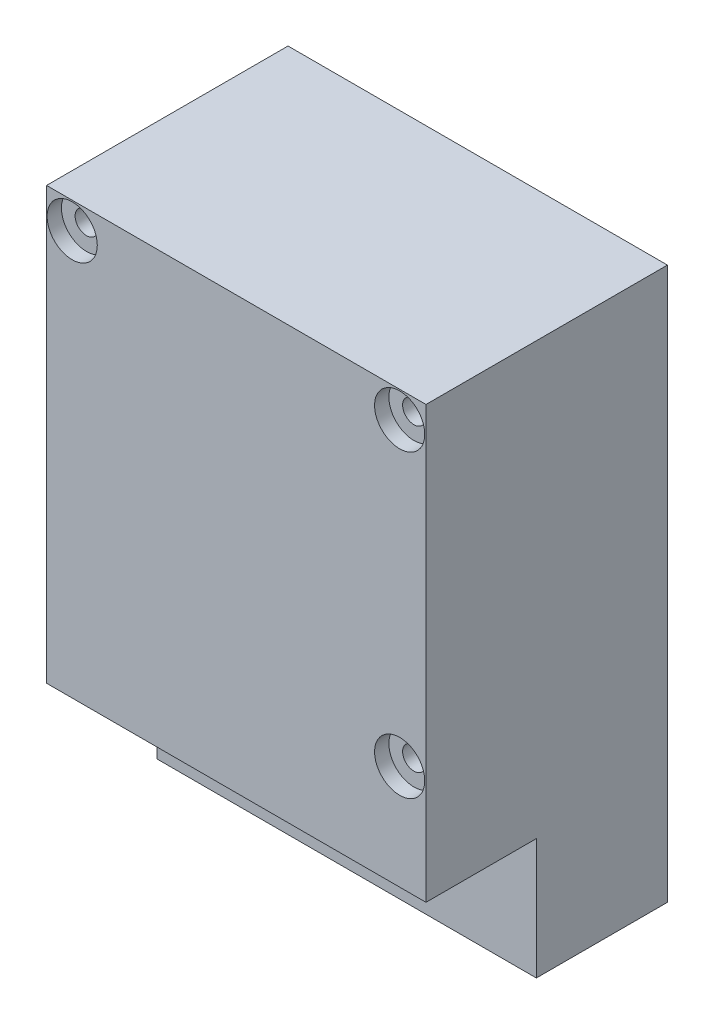
ISO-10303-21;
HEADER;
FILE_DESCRIPTION(('STEP AP214'),'2;1');
FILE_NAME('part.step','',(''),(''),'','','');
FILE_SCHEMA(('AUTOMOTIVE_DESIGN { 1 0 10303 214 1 1 1 1 }'));
ENDSEC;
DATA;
#1=APPLICATION_CONTEXT('core data for automotive mechanical design processes');
#2=APPLICATION_PROTOCOL_DEFINITION('international standard','automotive_design',2000,#1);
#3=PRODUCT_CONTEXT('',#1,'mechanical');
#4=PRODUCT('Part','Part','',(#3));
#5=PRODUCT_RELATED_PRODUCT_CATEGORY('part','',(#4));
#6=PRODUCT_DEFINITION_FORMATION('','',#4);
#7=PRODUCT_DEFINITION_CONTEXT('part definition',#1,'design');
#8=PRODUCT_DEFINITION('design','',#6,#7);
#9=PRODUCT_DEFINITION_SHAPE('','',#8);
#10=(LENGTH_UNIT() NAMED_UNIT(*) SI_UNIT(.MILLI.,.METRE.));
#11=(NAMED_UNIT(*) PLANE_ANGLE_UNIT() SI_UNIT($,.RADIAN.));
#12=(NAMED_UNIT(*) SI_UNIT($,.STERADIAN.) SOLID_ANGLE_UNIT());
#13=UNCERTAINTY_MEASURE_WITH_UNIT(LENGTH_MEASURE(1.E-05),#10,'distance_accuracy_value','');
#14=(GEOMETRIC_REPRESENTATION_CONTEXT(3) GLOBAL_UNCERTAINTY_ASSIGNED_CONTEXT((#13)) GLOBAL_UNIT_ASSIGNED_CONTEXT((#10,
#11,#12)) REPRESENTATION_CONTEXT('',''));
#15=CARTESIAN_POINT('',(0.,0.,0.));
#16=DIRECTION('',(0.,0.,1.));
#17=DIRECTION('',(1.,0.,0.));
#18=AXIS2_PLACEMENT_3D('',#15,#16,#17);
#19=CARTESIAN_POINT('',(-55.,-80.,70.));
#20=DIRECTION('',(0.,1.,0.));
#21=DIRECTION('',(0.,0.,1.));
#22=AXIS2_PLACEMENT_3D('',#19,#20,#21);
#23=PLANE('',#22);
#24=DIRECTION('',(1.,0.,0.));
#25=VECTOR('',#24,1.);
#26=CARTESIAN_POINT('',(-55.,-80.,38.));
#27=LINE('',#26,#25);
#28=CARTESIAN_POINT('',(-55.,-80.,38.));
#29=VERTEX_POINT('',#28);
#30=CARTESIAN_POINT('',(55.,-80.,38.));
#31=VERTEX_POINT('',#30);
#32=EDGE_CURVE('E104',#29,#31,#27,.T.);
#33=ORIENTED_EDGE('',*,*,#32,.F.);
#34=DIRECTION('',(0.,0.,-1.));
#35=VECTOR('',#34,1.);
#36=CARTESIAN_POINT('',(-55.,-80.,70.));
#37=LINE('',#36,#35);
#38=CARTESIAN_POINT('',(-55.,-80.,0.));
#39=VERTEX_POINT('',#38);
#40=EDGE_CURVE('E127',#29,#39,#37,.T.);
#41=ORIENTED_EDGE('',*,*,#40,.T.);
#42=DIRECTION('',(1.,0.,0.));
#43=VECTOR('',#42,1.);
#44=CARTESIAN_POINT('',(-55.,-80.,0.));
#45=LINE('',#44,#43);
#46=CARTESIAN_POINT('',(55.,-80.,0.));
#47=VERTEX_POINT('',#46);
#48=EDGE_CURVE('E120',#39,#47,#45,.T.);
#49=ORIENTED_EDGE('',*,*,#48,.T.);
#50=DIRECTION('',(0.,0.,-1.));
#51=VECTOR('',#50,1.);
#52=CARTESIAN_POINT('',(55.,-80.,70.));
#53=LINE('',#52,#51);
#54=EDGE_CURVE('E11',#31,#47,#53,.T.);
#55=ORIENTED_EDGE('',*,*,#54,.F.);
#56=EDGE_LOOP('',(#33,#41,#49,#55));
#57=FACE_BOUND('',#56,.T.);
#58=ADVANCED_FACE('F41',(#57),#23,.F.);
#59=CARTESIAN_POINT('',(55.,80.,70.));
#60=DIRECTION('',(1.,0.,0.));
#61=DIRECTION('',(0.,0.,-1.));
#62=AXIS2_PLACEMENT_3D('',#59,#60,#61);
#63=PLANE('',#62);
#64=DIRECTION('',(0.,0.,1.));
#65=VECTOR('',#64,1.);
#66=CARTESIAN_POINT('',(55.,-45.,70.));
#67=LINE('',#66,#65);
#68=CARTESIAN_POINT('',(55.,-45.,38.));
#69=VERTEX_POINT('',#68);
#70=CARTESIAN_POINT('',(55.,-45.,70.));
#71=VERTEX_POINT('',#70);
#72=EDGE_CURVE('E58',#69,#71,#67,.T.);
#73=ORIENTED_EDGE('',*,*,#72,.F.);
#74=DIRECTION('',(0.,-1.,0.));
#75=VECTOR('',#74,1.);
#76=CARTESIAN_POINT('',(55.,-45.,38.));
#77=LINE('',#76,#75);
#78=EDGE_CURVE('E94',#69,#31,#77,.T.);
#79=ORIENTED_EDGE('',*,*,#78,.T.);
#80=ORIENTED_EDGE('',*,*,#54,.T.);
#81=DIRECTION('',(0.,-1.,0.));
#82=VECTOR('',#81,1.);
#83=CARTESIAN_POINT('',(55.,80.,0.));
#84=LINE('',#83,#82);
#85=CARTESIAN_POINT('',(55.,80.,0.));
#86=VERTEX_POINT('',#85);
#87=EDGE_CURVE('E126',#86,#47,#84,.T.);
#88=ORIENTED_EDGE('',*,*,#87,.F.);
#89=DIRECTION('',(0.,0.,-1.));
#90=VECTOR('',#89,1.);
#91=CARTESIAN_POINT('',(55.,80.,70.));
#92=LINE('',#91,#90);
#93=CARTESIAN_POINT('',(55.,80.,70.));
#94=VERTEX_POINT('',#93);
#95=EDGE_CURVE('E48',#94,#86,#92,.T.);
#96=ORIENTED_EDGE('',*,*,#95,.F.);
#97=DIRECTION('',(0.,-1.,0.));
#98=VECTOR('',#97,1.);
#99=CARTESIAN_POINT('',(55.,80.,70.));
#100=LINE('',#99,#98);
#101=EDGE_CURVE('E98',#94,#71,#100,.T.);
#102=ORIENTED_EDGE('',*,*,#101,.T.);
#103=EDGE_LOOP('',(#73,#79,#80,#88,#96,#102));
#104=FACE_BOUND('',#103,.T.);
#105=ADVANCED_FACE('F95',(#104),#63,.T.);
#106=CARTESIAN_POINT('',(-55.,80.,70.));
#107=DIRECTION('',(1.,0.,0.));
#108=DIRECTION('',(0.,0.,-1.));
#109=AXIS2_PLACEMENT_3D('',#106,#107,#108);
#110=PLANE('',#109);
#111=DIRECTION('',(0.,-1.,0.));
#112=VECTOR('',#111,1.);
#113=CARTESIAN_POINT('',(-55.,-45.,38.));
#114=LINE('',#113,#112);
#115=CARTESIAN_POINT('',(-55.,-45.,38.));
#116=VERTEX_POINT('',#115);
#117=EDGE_CURVE('E102',#116,#29,#114,.T.);
#118=ORIENTED_EDGE('',*,*,#117,.F.);
#119=DIRECTION('',(0.,0.,-1.));
#120=VECTOR('',#119,1.);
#121=CARTESIAN_POINT('',(-55.,-45.,70.));
#122=LINE('',#121,#120);
#123=CARTESIAN_POINT('',(-55.,-45.,70.));
#124=VERTEX_POINT('',#123);
#125=EDGE_CURVE('E54',#124,#116,#122,.T.);
#126=ORIENTED_EDGE('',*,*,#125,.F.);
#127=DIRECTION('',(0.,-1.,0.));
#128=VECTOR('',#127,1.);
#129=CARTESIAN_POINT('',(-55.,80.,70.));
#130=LINE('',#129,#128);
#131=CARTESIAN_POINT('',(-55.,80.,70.));
#132=VERTEX_POINT('',#131);
#133=EDGE_CURVE('E124',#132,#124,#130,.T.);
#134=ORIENTED_EDGE('',*,*,#133,.F.);
#135=DIRECTION('',(0.,0.,-1.));
#136=VECTOR('',#135,1.);
#137=CARTESIAN_POINT('',(-55.,80.,70.));
#138=LINE('',#137,#136);
#139=CARTESIAN_POINT('',(-55.,80.,0.));
#140=VERTEX_POINT('',#139);
#141=EDGE_CURVE('E139',#132,#140,#138,.T.);
#142=ORIENTED_EDGE('',*,*,#141,.T.);
#143=DIRECTION('',(0.,-1.,0.));
#144=VECTOR('',#143,1.);
#145=CARTESIAN_POINT('',(-55.,80.,0.));
#146=LINE('',#145,#144);
#147=EDGE_CURVE('E119',#140,#39,#146,.T.);
#148=ORIENTED_EDGE('',*,*,#147,.T.);
#149=ORIENTED_EDGE('',*,*,#40,.F.);
#150=EDGE_LOOP('',(#118,#126,#134,#142,#148,#149));
#151=FACE_BOUND('',#150,.T.);
#152=ADVANCED_FACE('F148',(#151),#110,.F.);
#153=CARTESIAN_POINT('',(0.,0.,70.));
#154=DIRECTION('',(0.,0.,-1.));
#155=DIRECTION('',(-1.,0.,0.));
#156=AXIS2_PLACEMENT_3D('',#153,#154,#155);
#157=PLANE('',#156);
#158=CARTESIAN_POINT('',(-47.570659980975,72.3237014700051,70.));
#159=DIRECTION('',(0.,0.,1.));
#160=DIRECTION('',(1.,0.,0.));
#161=AXIS2_PLACEMENT_3D('',#158,#159,#160);
#162=CIRCLE('',#161,7.275);
#163=CARTESIAN_POINT('',(-40.295659980975,72.3237014700051,70.));
#164=VERTEX_POINT('',#163);
#165=EDGE_CURVE('E219',#164,#164,#162,.T.);
#166=ORIENTED_EDGE('',*,*,#165,.F.);
#167=EDGE_LOOP('',(#166));
#168=FACE_BOUND('',#167,.T.);
#169=CARTESIAN_POINT('',(47.3669312444398,72.3237014700051,70.));
#170=DIRECTION('',(0.,0.,1.));
#171=DIRECTION('',(1.,0.,0.));
#172=AXIS2_PLACEMENT_3D('',#169,#170,#171);
#173=CIRCLE('',#172,7.275);
#174=CARTESIAN_POINT('',(54.6419312444398,72.3237014700051,70.));
#175=VERTEX_POINT('',#174);
#176=EDGE_CURVE('E208',#175,#175,#173,.T.);
#177=ORIENTED_EDGE('',*,*,#176,.F.);
#178=EDGE_LOOP('',(#177));
#179=FACE_BOUND('',#178,.T.);
#180=CARTESIAN_POINT('',(47.3669312444398,-14.668469030536,70.));
#181=DIRECTION('',(0.,0.,1.));
#182=DIRECTION('',(1.,0.,0.));
#183=AXIS2_PLACEMENT_3D('',#180,#181,#182);
#184=CIRCLE('',#183,7.275);
#185=CARTESIAN_POINT('',(54.6419312444398,-14.668469030536,70.));
#186=VERTEX_POINT('',#185);
#187=EDGE_CURVE('E197',#186,#186,#184,.T.);
#188=ORIENTED_EDGE('',*,*,#187,.F.);
#189=EDGE_LOOP('',(#188));
#190=FACE_BOUND('',#189,.T.);
#191=DIRECTION('',(-1.,0.,0.));
#192=VECTOR('',#191,1.);
#193=CARTESIAN_POINT('',(-55.,-45.,70.));
#194=LINE('',#193,#192);
#195=EDGE_CURVE('E97',#71,#124,#194,.T.);
#196=ORIENTED_EDGE('',*,*,#195,.F.);
#197=ORIENTED_EDGE('',*,*,#101,.F.);
#198=DIRECTION('',(1.,0.,0.));
#199=VECTOR('',#198,1.);
#200=CARTESIAN_POINT('',(-55.,80.,70.));
#201=LINE('',#200,#199);
#202=EDGE_CURVE('E118',#132,#94,#201,.T.);
#203=ORIENTED_EDGE('',*,*,#202,.F.);
#204=ORIENTED_EDGE('',*,*,#133,.T.);
#205=EDGE_LOOP('',(#196,#197,#203,#204));
#206=FACE_BOUND('',#205,.T.);
#207=ADVANCED_FACE('F152',(#168,#179,#190,#206),#157,.F.);
#208=CARTESIAN_POINT('',(-55.,80.,70.));
#209=DIRECTION('',(0.,1.,0.));
#210=DIRECTION('',(0.,0.,1.));
#211=AXIS2_PLACEMENT_3D('',#208,#209,#210);
#212=PLANE('',#211);
#213=DIRECTION('',(1.,0.,0.));
#214=VECTOR('',#213,1.);
#215=CARTESIAN_POINT('',(-55.,80.,0.));
#216=LINE('',#215,#214);
#217=EDGE_CURVE('E135',#140,#86,#216,.T.);
#218=ORIENTED_EDGE('',*,*,#217,.F.);
#219=ORIENTED_EDGE('',*,*,#141,.F.);
#220=ORIENTED_EDGE('',*,*,#202,.T.);
#221=ORIENTED_EDGE('',*,*,#95,.T.);
#222=EDGE_LOOP('',(#218,#219,#220,#221));
#223=FACE_BOUND('',#222,.T.);
#224=ADVANCED_FACE('F145',(#223),#212,.T.);
#225=CARTESIAN_POINT('',(0.,0.,0.));
#226=DIRECTION('',(0.,0.,-1.));
#227=DIRECTION('',(-1.,0.,0.));
#228=AXIS2_PLACEMENT_3D('',#225,#226,#227);
#229=PLANE('',#228);
#230=CARTESIAN_POINT('',(-47.570659980975,72.3237014700051,0.));
#231=DIRECTION('',(0.,0.,1.));
#232=DIRECTION('',(1.,0.,0.));
#233=AXIS2_PLACEMENT_3D('',#230,#231,#232);
#234=CIRCLE('',#233,3.29999999999998);
#235=CARTESIAN_POINT('',(-44.2706599809751,72.3237014700051,0.));
#236=VERTEX_POINT('',#235);
#237=EDGE_CURVE('E183',#236,#236,#234,.T.);
#238=ORIENTED_EDGE('',*,*,#237,.T.);
#239=EDGE_LOOP('',(#238));
#240=FACE_BOUND('',#239,.T.);
#241=CARTESIAN_POINT('',(47.3669312444398,72.3237014700051,0.));
#242=DIRECTION('',(0.,0.,1.));
#243=DIRECTION('',(1.,0.,0.));
#244=AXIS2_PLACEMENT_3D('',#241,#242,#243);
#245=CIRCLE('',#244,3.29999999999998);
#246=CARTESIAN_POINT('',(50.6669312444398,72.3237014700051,0.));
#247=VERTEX_POINT('',#246);
#248=EDGE_CURVE('E189',#247,#247,#245,.T.);
#249=ORIENTED_EDGE('',*,*,#248,.T.);
#250=EDGE_LOOP('',(#249));
#251=FACE_BOUND('',#250,.T.);
#252=CARTESIAN_POINT('',(47.3669312444398,-14.668469030536,0.));
#253=DIRECTION('',(0.,0.,1.));
#254=DIRECTION('',(1.,0.,0.));
#255=AXIS2_PLACEMENT_3D('',#252,#253,#254);
#256=CIRCLE('',#255,3.29999999999998);
#257=CARTESIAN_POINT('',(50.6669312444398,-14.668469030536,0.));
#258=VERTEX_POINT('',#257);
#259=EDGE_CURVE('E109',#258,#258,#256,.T.);
#260=ORIENTED_EDGE('',*,*,#259,.T.);
#261=EDGE_LOOP('',(#260));
#262=FACE_BOUND('',#261,.T.);
#263=ORIENTED_EDGE('',*,*,#48,.F.);
#264=ORIENTED_EDGE('',*,*,#147,.F.);
#265=ORIENTED_EDGE('',*,*,#217,.T.);
#266=ORIENTED_EDGE('',*,*,#87,.T.);
#267=EDGE_LOOP('',(#263,#264,#265,#266));
#268=FACE_BOUND('',#267,.T.);
#269=ADVANCED_FACE('F150',(#240,#251,#262,#268),#229,.T.);
#270=CARTESIAN_POINT('',(0.,-45.,0.));
#271=DIRECTION('',(0.,-1.,0.));
#272=DIRECTION('',(0.,0.,-1.));
#273=AXIS2_PLACEMENT_3D('',#270,#271,#272);
#274=PLANE('',#273);
#275=ORIENTED_EDGE('',*,*,#125,.T.);
#276=DIRECTION('',(1.,0.,0.));
#277=VECTOR('',#276,1.);
#278=CARTESIAN_POINT('',(-55.,-45.,38.));
#279=LINE('',#278,#277);
#280=EDGE_CURVE('E103',#116,#69,#279,.T.);
#281=ORIENTED_EDGE('',*,*,#280,.T.);
#282=ORIENTED_EDGE('',*,*,#72,.T.);
#283=ORIENTED_EDGE('',*,*,#195,.T.);
#284=EDGE_LOOP('',(#275,#281,#282,#283));
#285=FACE_BOUND('',#284,.T.);
#286=ADVANCED_FACE('F110',(#285),#274,.T.);
#287=CARTESIAN_POINT('',(-55.,-45.,38.));
#288=DIRECTION('',(0.,0.,-1.));
#289=DIRECTION('',(-1.,0.,0.));
#290=AXIS2_PLACEMENT_3D('',#287,#288,#289);
#291=PLANE('',#290);
#292=ORIENTED_EDGE('',*,*,#32,.T.);
#293=ORIENTED_EDGE('',*,*,#78,.F.);
#294=ORIENTED_EDGE('',*,*,#280,.F.);
#295=ORIENTED_EDGE('',*,*,#117,.T.);
#296=EDGE_LOOP('',(#292,#293,#294,#295));
#297=FACE_BOUND('',#296,.T.);
#298=ADVANCED_FACE('F99',(#297),#291,.F.);
#299=CARTESIAN_POINT('',(47.3669312444398,-14.668469030536,70.));
#300=DIRECTION('',(0.,0.,1.));
#301=DIRECTION('',(1.,0.,0.));
#302=AXIS2_PLACEMENT_3D('',#299,#300,#301);
#303=CYLINDRICAL_SURFACE('',#302,3.29999999999999);
#304=ORIENTED_EDGE('',*,*,#259,.F.);
#305=EDGE_LOOP('',(#304));
#306=FACE_BOUND('',#305,.T.);
#307=CARTESIAN_POINT('',(47.3669312444398,-14.668469030536,65.85));
#308=DIRECTION('',(0.,0.,1.));
#309=DIRECTION('',(1.,0.,0.));
#310=AXIS2_PLACEMENT_3D('',#307,#308,#309);
#311=CIRCLE('',#310,3.3);
#312=CARTESIAN_POINT('',(50.6669312444398,-14.668469030536,65.85));
#313=VERTEX_POINT('',#312);
#314=EDGE_CURVE('E195',#313,#313,#311,.T.);
#315=ORIENTED_EDGE('',*,*,#314,.T.);
#316=EDGE_LOOP('',(#315));
#317=FACE_BOUND('',#316,.T.);
#318=ADVANCED_FACE('F259',(#306,#317),#303,.F.);
#319=CARTESIAN_POINT('',(50.6669312444398,-14.668469030536,65.85));
#320=DIRECTION('',(0.,0.,-1.));
#321=DIRECTION('',(-1.,0.,0.));
#322=AXIS2_PLACEMENT_3D('',#319,#320,#321);
#323=PLANE('',#322);
#324=ORIENTED_EDGE('',*,*,#314,.F.);
#325=EDGE_LOOP('',(#324));
#326=FACE_BOUND('',#325,.T.);
#327=CARTESIAN_POINT('',(47.3669312444398,-14.668469030536,65.85));
#328=DIRECTION('',(0.,0.,1.));
#329=DIRECTION('',(1.,0.,0.));
#330=AXIS2_PLACEMENT_3D('',#327,#328,#329);
#331=CIRCLE('',#330,7.275);
#332=CARTESIAN_POINT('',(54.6419312444398,-14.668469030536,65.85));
#333=VERTEX_POINT('',#332);
#334=EDGE_CURVE('E191',#333,#333,#331,.T.);
#335=ORIENTED_EDGE('',*,*,#334,.T.);
#336=EDGE_LOOP('',(#335));
#337=FACE_BOUND('',#336,.T.);
#338=ADVANCED_FACE('F251',(#326,#337),#323,.F.);
#339=CARTESIAN_POINT('',(47.3669312444398,-14.668469030536,70.));
#340=DIRECTION('',(0.,0.,1.));
#341=DIRECTION('',(1.,0.,0.));
#342=AXIS2_PLACEMENT_3D('',#339,#340,#341);
#343=CYLINDRICAL_SURFACE('',#342,7.275);
#344=ORIENTED_EDGE('',*,*,#334,.F.);
#345=EDGE_LOOP('',(#344));
#346=FACE_BOUND('',#345,.T.);
#347=ORIENTED_EDGE('',*,*,#187,.T.);
#348=EDGE_LOOP('',(#347));
#349=FACE_BOUND('',#348,.T.);
#350=ADVANCED_FACE('F249',(#346,#349),#343,.F.);
#351=CARTESIAN_POINT('',(47.3669312444398,72.3237014700051,70.));
#352=DIRECTION('',(0.,0.,1.));
#353=DIRECTION('',(1.,0.,0.));
#354=AXIS2_PLACEMENT_3D('',#351,#352,#353);
#355=CYLINDRICAL_SURFACE('',#354,3.29999999999999);
#356=ORIENTED_EDGE('',*,*,#248,.F.);
#357=EDGE_LOOP('',(#356));
#358=FACE_BOUND('',#357,.T.);
#359=CARTESIAN_POINT('',(47.3669312444398,72.3237014700051,65.85));
#360=DIRECTION('',(0.,0.,1.));
#361=DIRECTION('',(1.,0.,0.));
#362=AXIS2_PLACEMENT_3D('',#359,#360,#361);
#363=CIRCLE('',#362,3.3);
#364=CARTESIAN_POINT('',(50.6669312444398,72.3237014700051,65.85));
#365=VERTEX_POINT('',#364);
#366=EDGE_CURVE('E201',#365,#365,#363,.T.);
#367=ORIENTED_EDGE('',*,*,#366,.T.);
#368=EDGE_LOOP('',(#367));
#369=FACE_BOUND('',#368,.T.);
#370=ADVANCED_FACE('F246',(#358,#369),#355,.F.);
#371=CARTESIAN_POINT('',(50.6669312444398,72.3237014700051,65.85));
#372=DIRECTION('',(0.,0.,-1.));
#373=DIRECTION('',(-1.,0.,0.));
#374=AXIS2_PLACEMENT_3D('',#371,#372,#373);
#375=PLANE('',#374);
#376=ORIENTED_EDGE('',*,*,#366,.F.);
#377=EDGE_LOOP('',(#376));
#378=FACE_BOUND('',#377,.T.);
#379=CARTESIAN_POINT('',(47.3669312444398,72.3237014700051,65.85));
#380=DIRECTION('',(0.,0.,1.));
#381=DIRECTION('',(1.,0.,0.));
#382=AXIS2_PLACEMENT_3D('',#379,#380,#381);
#383=CIRCLE('',#382,7.275);
#384=CARTESIAN_POINT('',(54.6419312444398,72.3237014700051,65.85));
#385=VERTEX_POINT('',#384);
#386=EDGE_CURVE('E210',#385,#385,#383,.T.);
#387=ORIENTED_EDGE('',*,*,#386,.T.);
#388=EDGE_LOOP('',(#387));
#389=FACE_BOUND('',#388,.T.);
#390=ADVANCED_FACE('F245',(#378,#389),#375,.F.);
#391=CARTESIAN_POINT('',(47.3669312444398,72.3237014700051,70.));
#392=DIRECTION('',(0.,0.,1.));
#393=DIRECTION('',(1.,0.,0.));
#394=AXIS2_PLACEMENT_3D('',#391,#392,#393);
#395=CYLINDRICAL_SURFACE('',#394,7.275);
#396=ORIENTED_EDGE('',*,*,#386,.F.);
#397=EDGE_LOOP('',(#396));
#398=FACE_BOUND('',#397,.T.);
#399=ORIENTED_EDGE('',*,*,#176,.T.);
#400=EDGE_LOOP('',(#399));
#401=FACE_BOUND('',#400,.T.);
#402=ADVANCED_FACE('F238',(#398,#401),#395,.F.);
#403=CARTESIAN_POINT('',(-47.570659980975,72.3237014700051,70.));
#404=DIRECTION('',(0.,0.,1.));
#405=DIRECTION('',(1.,0.,0.));
#406=AXIS2_PLACEMENT_3D('',#403,#404,#405);
#407=CYLINDRICAL_SURFACE('',#406,3.29999999999999);
#408=ORIENTED_EDGE('',*,*,#237,.F.);
#409=EDGE_LOOP('',(#408));
#410=FACE_BOUND('',#409,.T.);
#411=CARTESIAN_POINT('',(-47.570659980975,72.3237014700051,65.85));
#412=DIRECTION('',(0.,0.,1.));
#413=DIRECTION('',(1.,0.,0.));
#414=AXIS2_PLACEMENT_3D('',#411,#412,#413);
#415=CIRCLE('',#414,3.3);
#416=CARTESIAN_POINT('',(-44.270659980975,72.3237014700051,65.85));
#417=VERTEX_POINT('',#416);
#418=EDGE_CURVE('E211',#417,#417,#415,.T.);
#419=ORIENTED_EDGE('',*,*,#418,.T.);
#420=EDGE_LOOP('',(#419));
#421=FACE_BOUND('',#420,.T.);
#422=ADVANCED_FACE('F233',(#410,#421),#407,.F.);
#423=CARTESIAN_POINT('',(-44.270659980975,72.3237014700051,65.85));
#424=DIRECTION('',(0.,0.,-1.));
#425=DIRECTION('',(-1.,0.,0.));
#426=AXIS2_PLACEMENT_3D('',#423,#424,#425);
#427=PLANE('',#426);
#428=ORIENTED_EDGE('',*,*,#418,.F.);
#429=EDGE_LOOP('',(#428));
#430=FACE_BOUND('',#429,.T.);
#431=CARTESIAN_POINT('',(-47.570659980975,72.3237014700051,65.85));
#432=DIRECTION('',(0.,0.,1.));
#433=DIRECTION('',(1.,0.,0.));
#434=AXIS2_PLACEMENT_3D('',#431,#432,#433);
#435=CIRCLE('',#434,7.275);
#436=CARTESIAN_POINT('',(-40.295659980975,72.3237014700051,65.85));
#437=VERTEX_POINT('',#436);
#438=EDGE_CURVE('E220',#437,#437,#435,.T.);
#439=ORIENTED_EDGE('',*,*,#438,.T.);
#440=EDGE_LOOP('',(#439));
#441=FACE_BOUND('',#440,.T.);
#442=ADVANCED_FACE('F223',(#430,#441),#427,.F.);
#443=CARTESIAN_POINT('',(-47.570659980975,72.3237014700051,70.));
#444=DIRECTION('',(0.,0.,1.));
#445=DIRECTION('',(1.,0.,0.));
#446=AXIS2_PLACEMENT_3D('',#443,#444,#445);
#447=CYLINDRICAL_SURFACE('',#446,7.275);
#448=ORIENTED_EDGE('',*,*,#438,.F.);
#449=EDGE_LOOP('',(#448));
#450=FACE_BOUND('',#449,.T.);
#451=ORIENTED_EDGE('',*,*,#165,.T.);
#452=EDGE_LOOP('',(#451));
#453=FACE_BOUND('',#452,.T.);
#454=ADVANCED_FACE('F224',(#450,#453),#447,.F.);
#455=CLOSED_SHELL('',(#58,#105,#152,#207,#224,#269,#286,#298,#318,#338,#350,#370,#390,#402,#422,
#442,#454));
#456=MANIFOLD_SOLID_BREP('B2',#455);
#457=ADVANCED_BREP_SHAPE_REPRESENTATION('',(#18,#456),#14);
#458=SHAPE_DEFINITION_REPRESENTATION(#9,#457);
ENDSEC;
END-ISO-10303-21;
